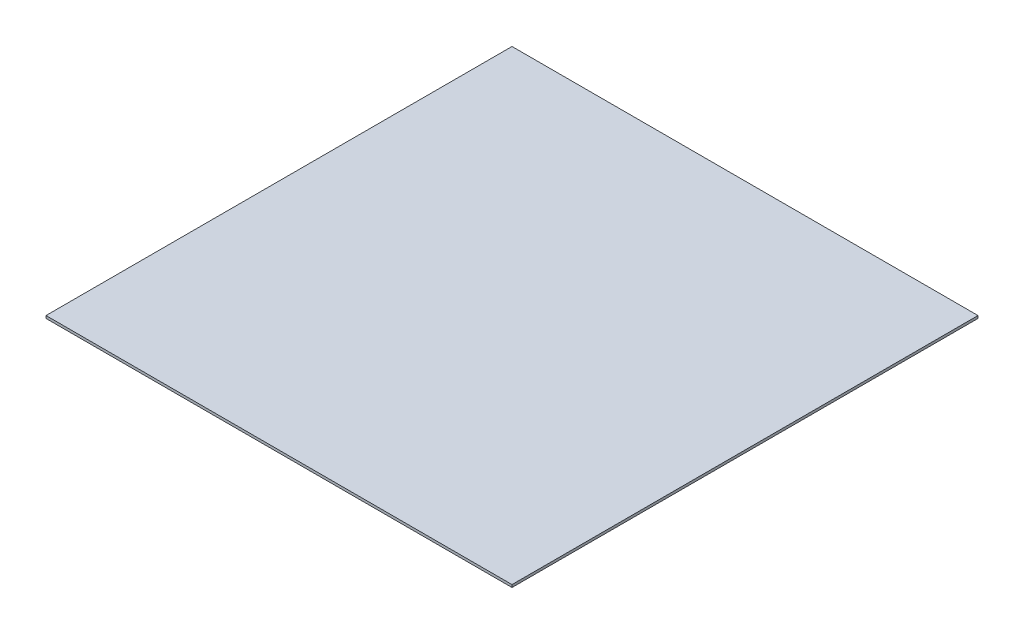
ISO-10303-21;
HEADER;
FILE_DESCRIPTION(('STEP AP214'),'2;1');
FILE_NAME('part.step','',(''),(''),'','','');
FILE_SCHEMA(('AUTOMOTIVE_DESIGN { 1 0 10303 214 1 1 1 1 }'));
ENDSEC;
DATA;
#1=APPLICATION_CONTEXT('core data for automotive mechanical design processes');
#2=APPLICATION_PROTOCOL_DEFINITION('international standard','automotive_design',2000,#1);
#3=PRODUCT_CONTEXT('',#1,'mechanical');
#4=PRODUCT('Part','Part','',(#3));
#5=PRODUCT_RELATED_PRODUCT_CATEGORY('part','',(#4));
#6=PRODUCT_DEFINITION_FORMATION('','',#4);
#7=PRODUCT_DEFINITION_CONTEXT('part definition',#1,'design');
#8=PRODUCT_DEFINITION('design','',#6,#7);
#9=PRODUCT_DEFINITION_SHAPE('','',#8);
#10=(LENGTH_UNIT() NAMED_UNIT(*) SI_UNIT(.MILLI.,.METRE.));
#11=(NAMED_UNIT(*) PLANE_ANGLE_UNIT() SI_UNIT($,.RADIAN.));
#12=(NAMED_UNIT(*) SI_UNIT($,.STERADIAN.) SOLID_ANGLE_UNIT());
#13=UNCERTAINTY_MEASURE_WITH_UNIT(LENGTH_MEASURE(1.E-05),#10,'distance_accuracy_value','');
#14=(GEOMETRIC_REPRESENTATION_CONTEXT(3) GLOBAL_UNCERTAINTY_ASSIGNED_CONTEXT((#13)) GLOBAL_UNIT_ASSIGNED_CONTEXT((#10,
#11,#12)) REPRESENTATION_CONTEXT('',''));
#15=CARTESIAN_POINT('',(0.,0.,0.));
#16=DIRECTION('',(0.,0.,1.));
#17=DIRECTION('',(1.,0.,0.));
#18=AXIS2_PLACEMENT_3D('',#15,#16,#17);
#19=CARTESIAN_POINT('',(273.,3.,-273.));
#20=DIRECTION('',(-1.,0.,0.));
#21=DIRECTION('',(0.,0.,1.));
#22=AXIS2_PLACEMENT_3D('',#19,#20,#21);
#23=PLANE('',#22);
#24=DIRECTION('',(0.,0.,-1.));
#25=VECTOR('',#24,1.);
#26=CARTESIAN_POINT('',(273.,0.,-273.));
#27=LINE('',#26,#25);
#28=CARTESIAN_POINT('',(273.,0.,273.));
#29=VERTEX_POINT('',#28);
#30=CARTESIAN_POINT('',(273.,0.,-273.));
#31=VERTEX_POINT('',#30);
#32=EDGE_CURVE('E115',#29,#31,#27,.T.);
#33=ORIENTED_EDGE('',*,*,#32,.T.);
#34=DIRECTION('',(0.,-1.,0.));
#35=VECTOR('',#34,1.);
#36=CARTESIAN_POINT('',(273.,3.,-273.));
#37=LINE('',#36,#35);
#38=CARTESIAN_POINT('',(273.,3.,-273.));
#39=VERTEX_POINT('',#38);
#40=EDGE_CURVE('E11',#39,#31,#37,.T.);
#41=ORIENTED_EDGE('',*,*,#40,.F.);
#42=DIRECTION('',(0.,0.,-1.));
#43=VECTOR('',#42,1.);
#44=CARTESIAN_POINT('',(273.,3.,-273.));
#45=LINE('',#44,#43);
#46=CARTESIAN_POINT('',(273.,3.,273.));
#47=VERTEX_POINT('',#46);
#48=EDGE_CURVE('E99',#47,#39,#45,.T.);
#49=ORIENTED_EDGE('',*,*,#48,.F.);
#50=DIRECTION('',(0.,-1.,0.));
#51=VECTOR('',#50,1.);
#52=CARTESIAN_POINT('',(273.,3.,273.));
#53=LINE('',#52,#51);
#54=EDGE_CURVE('E111',#47,#29,#53,.T.);
#55=ORIENTED_EDGE('',*,*,#54,.T.);
#56=EDGE_LOOP('',(#33,#41,#49,#55));
#57=FACE_BOUND('',#56,.T.);
#58=ADVANCED_FACE('F47',(#57),#23,.F.);
#59=CARTESIAN_POINT('',(-273.,3.,-273.));
#60=DIRECTION('',(0.,0.,1.));
#61=DIRECTION('',(1.,0.,0.));
#62=AXIS2_PLACEMENT_3D('',#59,#60,#61);
#63=PLANE('',#62);
#64=DIRECTION('',(-1.,0.,0.));
#65=VECTOR('',#64,1.);
#66=CARTESIAN_POINT('',(-273.,0.,-273.));
#67=LINE('',#66,#65);
#68=CARTESIAN_POINT('',(-273.,0.,-273.));
#69=VERTEX_POINT('',#68);
#70=EDGE_CURVE('E104',#31,#69,#67,.T.);
#71=ORIENTED_EDGE('',*,*,#70,.T.);
#72=DIRECTION('',(0.,-1.,0.));
#73=VECTOR('',#72,1.);
#74=CARTESIAN_POINT('',(-273.,3.,-273.));
#75=LINE('',#74,#73);
#76=CARTESIAN_POINT('',(-273.,3.,-273.));
#77=VERTEX_POINT('',#76);
#78=EDGE_CURVE('E56',#77,#69,#75,.T.);
#79=ORIENTED_EDGE('',*,*,#78,.F.);
#80=DIRECTION('',(-1.,0.,0.));
#81=VECTOR('',#80,1.);
#82=CARTESIAN_POINT('',(-273.,3.,-273.));
#83=LINE('',#82,#81);
#84=EDGE_CURVE('E94',#39,#77,#83,.T.);
#85=ORIENTED_EDGE('',*,*,#84,.F.);
#86=ORIENTED_EDGE('',*,*,#40,.T.);
#87=EDGE_LOOP('',(#71,#79,#85,#86));
#88=FACE_BOUND('',#87,.T.);
#89=ADVANCED_FACE('F103',(#88),#63,.F.);
#90=CARTESIAN_POINT('',(-273.,3.,-273.));
#91=DIRECTION('',(1.,0.,0.));
#92=DIRECTION('',(0.,0.,-1.));
#93=AXIS2_PLACEMENT_3D('',#90,#91,#92);
#94=PLANE('',#93);
#95=DIRECTION('',(0.,0.,1.));
#96=VECTOR('',#95,1.);
#97=CARTESIAN_POINT('',(-273.,0.,-273.));
#98=LINE('',#97,#96);
#99=CARTESIAN_POINT('',(-273.,0.,273.));
#100=VERTEX_POINT('',#99);
#101=EDGE_CURVE('E81',#69,#100,#98,.T.);
#102=ORIENTED_EDGE('',*,*,#101,.T.);
#103=DIRECTION('',(0.,-1.,0.));
#104=VECTOR('',#103,1.);
#105=CARTESIAN_POINT('',(-273.,3.,273.));
#106=LINE('',#105,#104);
#107=CARTESIAN_POINT('',(-273.,3.,273.));
#108=VERTEX_POINT('',#107);
#109=EDGE_CURVE('E106',#108,#100,#106,.T.);
#110=ORIENTED_EDGE('',*,*,#109,.F.);
#111=DIRECTION('',(0.,0.,1.));
#112=VECTOR('',#111,1.);
#113=CARTESIAN_POINT('',(-273.,3.,-273.));
#114=LINE('',#113,#112);
#115=EDGE_CURVE('E97',#77,#108,#114,.T.);
#116=ORIENTED_EDGE('',*,*,#115,.F.);
#117=ORIENTED_EDGE('',*,*,#78,.T.);
#118=EDGE_LOOP('',(#102,#110,#116,#117));
#119=FACE_BOUND('',#118,.T.);
#120=ADVANCED_FACE('F107',(#119),#94,.F.);
#121=CARTESIAN_POINT('',(-273.,3.,273.));
#122=DIRECTION('',(0.,0.,-1.));
#123=DIRECTION('',(-1.,0.,0.));
#124=AXIS2_PLACEMENT_3D('',#121,#122,#123);
#125=PLANE('',#124);
#126=DIRECTION('',(1.,0.,0.));
#127=VECTOR('',#126,1.);
#128=CARTESIAN_POINT('',(-273.,0.,273.));
#129=LINE('',#128,#127);
#130=EDGE_CURVE('E87',#100,#29,#129,.T.);
#131=ORIENTED_EDGE('',*,*,#130,.T.);
#132=ORIENTED_EDGE('',*,*,#54,.F.);
#133=DIRECTION('',(1.,0.,0.));
#134=VECTOR('',#133,1.);
#135=CARTESIAN_POINT('',(-273.,3.,273.));
#136=LINE('',#135,#134);
#137=EDGE_CURVE('E64',#108,#47,#136,.T.);
#138=ORIENTED_EDGE('',*,*,#137,.F.);
#139=ORIENTED_EDGE('',*,*,#109,.T.);
#140=EDGE_LOOP('',(#131,#132,#138,#139));
#141=FACE_BOUND('',#140,.T.);
#142=ADVANCED_FACE('F128',(#141),#125,.F.);
#143=CARTESIAN_POINT('',(0.,3.,0.));
#144=DIRECTION('',(0.,1.,0.));
#145=DIRECTION('',(0.,0.,1.));
#146=AXIS2_PLACEMENT_3D('',#143,#144,#145);
#147=PLANE('',#146);
#148=ORIENTED_EDGE('',*,*,#48,.T.);
#149=ORIENTED_EDGE('',*,*,#84,.T.);
#150=ORIENTED_EDGE('',*,*,#115,.T.);
#151=ORIENTED_EDGE('',*,*,#137,.T.);
#152=EDGE_LOOP('',(#148,#149,#150,#151));
#153=FACE_BOUND('',#152,.T.);
#154=ADVANCED_FACE('F95',(#153),#147,.T.);
#155=CARTESIAN_POINT('',(0.,0.,0.));
#156=DIRECTION('',(0.,1.,0.));
#157=DIRECTION('',(0.,0.,1.));
#158=AXIS2_PLACEMENT_3D('',#155,#156,#157);
#159=PLANE('',#158);
#160=ORIENTED_EDGE('',*,*,#32,.F.);
#161=ORIENTED_EDGE('',*,*,#130,.F.);
#162=ORIENTED_EDGE('',*,*,#101,.F.);
#163=ORIENTED_EDGE('',*,*,#70,.F.);
#164=EDGE_LOOP('',(#160,#161,#162,#163));
#165=FACE_BOUND('',#164,.T.);
#166=ADVANCED_FACE('F131',(#165),#159,.F.);
#167=CLOSED_SHELL('',(#58,#89,#120,#142,#154,#166));
#168=MANIFOLD_SOLID_BREP('B2',#167);
#169=ADVANCED_BREP_SHAPE_REPRESENTATION('',(#18,#168),#14);
#170=SHAPE_DEFINITION_REPRESENTATION(#9,#169);
ENDSEC;
END-ISO-10303-21;
